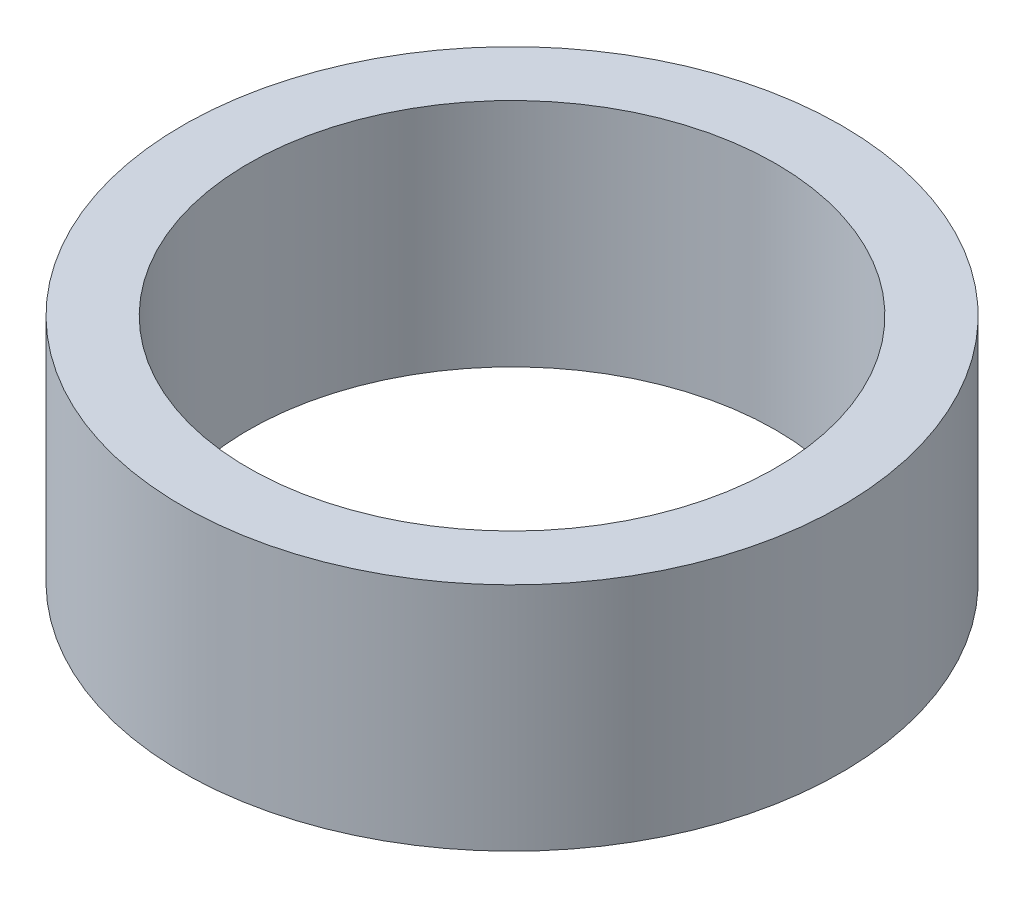
ISO-10303-21;
HEADER;
FILE_DESCRIPTION(('STEP AP214'),'2;1');
FILE_NAME('part.step','',(''),(''),'','','');
FILE_SCHEMA(('AUTOMOTIVE_DESIGN { 1 0 10303 214 1 1 1 1 }'));
ENDSEC;
DATA;
#1=APPLICATION_CONTEXT('core data for automotive mechanical design processes');
#2=APPLICATION_PROTOCOL_DEFINITION('international standard','automotive_design',2000,#1);
#3=PRODUCT_CONTEXT('',#1,'mechanical');
#4=PRODUCT('Part','Part','',(#3));
#5=PRODUCT_RELATED_PRODUCT_CATEGORY('part','',(#4));
#6=PRODUCT_DEFINITION_FORMATION('','',#4);
#7=PRODUCT_DEFINITION_CONTEXT('part definition',#1,'design');
#8=PRODUCT_DEFINITION('design','',#6,#7);
#9=PRODUCT_DEFINITION_SHAPE('','',#8);
#10=(LENGTH_UNIT() NAMED_UNIT(*) SI_UNIT(.MILLI.,.METRE.));
#11=(NAMED_UNIT(*) PLANE_ANGLE_UNIT() SI_UNIT($,.RADIAN.));
#12=(NAMED_UNIT(*) SI_UNIT($,.STERADIAN.) SOLID_ANGLE_UNIT());
#13=UNCERTAINTY_MEASURE_WITH_UNIT(LENGTH_MEASURE(1.E-05),#10,'distance_accuracy_value','');
#14=(GEOMETRIC_REPRESENTATION_CONTEXT(3) GLOBAL_UNCERTAINTY_ASSIGNED_CONTEXT((#13)) GLOBAL_UNIT_ASSIGNED_CONTEXT((#10,
#11,#12)) REPRESENTATION_CONTEXT('',''));
#15=CARTESIAN_POINT('',(0.,0.,0.));
#16=DIRECTION('',(0.,0.,1.));
#17=DIRECTION('',(1.,0.,0.));
#18=AXIS2_PLACEMENT_3D('',#15,#16,#17);
#19=CARTESIAN_POINT('',(0.,11.1125,0.));
#20=DIRECTION('',(0.,-1.,0.));
#21=DIRECTION('',(0.,0.,-1.));
#22=AXIS2_PLACEMENT_3D('',#19,#20,#21);
#23=CYLINDRICAL_SURFACE('',#22,12.7);
#24=CARTESIAN_POINT('',(0.,0.,0.));
#25=DIRECTION('',(0.,-1.,0.));
#26=DIRECTION('',(0.,0.,-1.));
#27=AXIS2_PLACEMENT_3D('',#24,#25,#26);
#28=CIRCLE('',#27,12.7);
#29=CARTESIAN_POINT('',(0.,0.,-12.7));
#30=VERTEX_POINT('',#29);
#31=EDGE_CURVE('E27',#30,#30,#28,.T.);
#32=ORIENTED_EDGE('',*,*,#31,.T.);
#33=EDGE_LOOP('',(#32));
#34=FACE_BOUND('',#33,.T.);
#35=CARTESIAN_POINT('',(0.,11.1125,0.));
#36=DIRECTION('',(0.,-1.,0.));
#37=DIRECTION('',(0.,0.,-1.));
#38=AXIS2_PLACEMENT_3D('',#35,#36,#37);
#39=CIRCLE('',#38,12.7);
#40=CARTESIAN_POINT('',(0.,11.1125,-12.7));
#41=VERTEX_POINT('',#40);
#42=EDGE_CURVE('E18',#41,#41,#39,.T.);
#43=ORIENTED_EDGE('',*,*,#42,.F.);
#44=EDGE_LOOP('',(#43));
#45=FACE_BOUND('',#44,.T.);
#46=ADVANCED_FACE('F15',(#34,#45),#23,.F.);
#47=CARTESIAN_POINT('',(0.,11.1125,0.));
#48=DIRECTION('',(0.,1.,0.));
#49=DIRECTION('',(0.,0.,1.));
#50=AXIS2_PLACEMENT_3D('',#47,#48,#49);
#51=PLANE('',#50);
#52=ORIENTED_EDGE('',*,*,#42,.T.);
#53=EDGE_LOOP('',(#52));
#54=FACE_BOUND('',#53,.T.);
#55=CARTESIAN_POINT('',(0.,11.1125,0.));
#56=DIRECTION('',(0.,-1.,0.));
#57=DIRECTION('',(0.,0.,-1.));
#58=AXIS2_PLACEMENT_3D('',#55,#56,#57);
#59=CIRCLE('',#58,15.875);
#60=CARTESIAN_POINT('',(0.,11.1125,-15.875));
#61=VERTEX_POINT('',#60);
#62=EDGE_CURVE('E22',#61,#61,#59,.T.);
#63=ORIENTED_EDGE('',*,*,#62,.F.);
#64=EDGE_LOOP('',(#63));
#65=FACE_BOUND('',#64,.T.);
#66=ADVANCED_FACE('F35',(#54,#65),#51,.T.);
#67=CARTESIAN_POINT('',(0.,0.,0.));
#68=DIRECTION('',(0.,1.,0.));
#69=DIRECTION('',(0.,0.,1.));
#70=AXIS2_PLACEMENT_3D('',#67,#68,#69);
#71=PLANE('',#70);
#72=ORIENTED_EDGE('',*,*,#31,.F.);
#73=EDGE_LOOP('',(#72));
#74=FACE_BOUND('',#73,.T.);
#75=CARTESIAN_POINT('',(0.,0.,0.));
#76=DIRECTION('',(0.,-1.,0.));
#77=DIRECTION('',(0.,0.,-1.));
#78=AXIS2_PLACEMENT_3D('',#75,#76,#77);
#79=CIRCLE('',#78,15.875);
#80=CARTESIAN_POINT('',(0.,0.,-15.875));
#81=VERTEX_POINT('',#80);
#82=EDGE_CURVE('E10',#81,#81,#79,.F.);
#83=ORIENTED_EDGE('',*,*,#82,.F.);
#84=EDGE_LOOP('',(#83));
#85=FACE_BOUND('',#84,.T.);
#86=ADVANCED_FACE('F43',(#74,#85),#71,.F.);
#87=CARTESIAN_POINT('',(0.,11.1125,0.));
#88=DIRECTION('',(0.,-1.,0.));
#89=DIRECTION('',(0.,0.,-1.));
#90=AXIS2_PLACEMENT_3D('',#87,#88,#89);
#91=CYLINDRICAL_SURFACE('',#90,15.875);
#92=ORIENTED_EDGE('',*,*,#82,.T.);
#93=EDGE_LOOP('',(#92));
#94=FACE_BOUND('',#93,.T.);
#95=ORIENTED_EDGE('',*,*,#62,.T.);
#96=EDGE_LOOP('',(#95));
#97=FACE_BOUND('',#96,.T.);
#98=ADVANCED_FACE('F44',(#94,#97),#91,.T.);
#99=CLOSED_SHELL('',(#46,#66,#86,#98));
#100=MANIFOLD_SOLID_BREP('B1',#99);
#101=ADVANCED_BREP_SHAPE_REPRESENTATION('',(#18,#100),#14);
#102=SHAPE_DEFINITION_REPRESENTATION(#9,#101);
ENDSEC;
END-ISO-10303-21;
